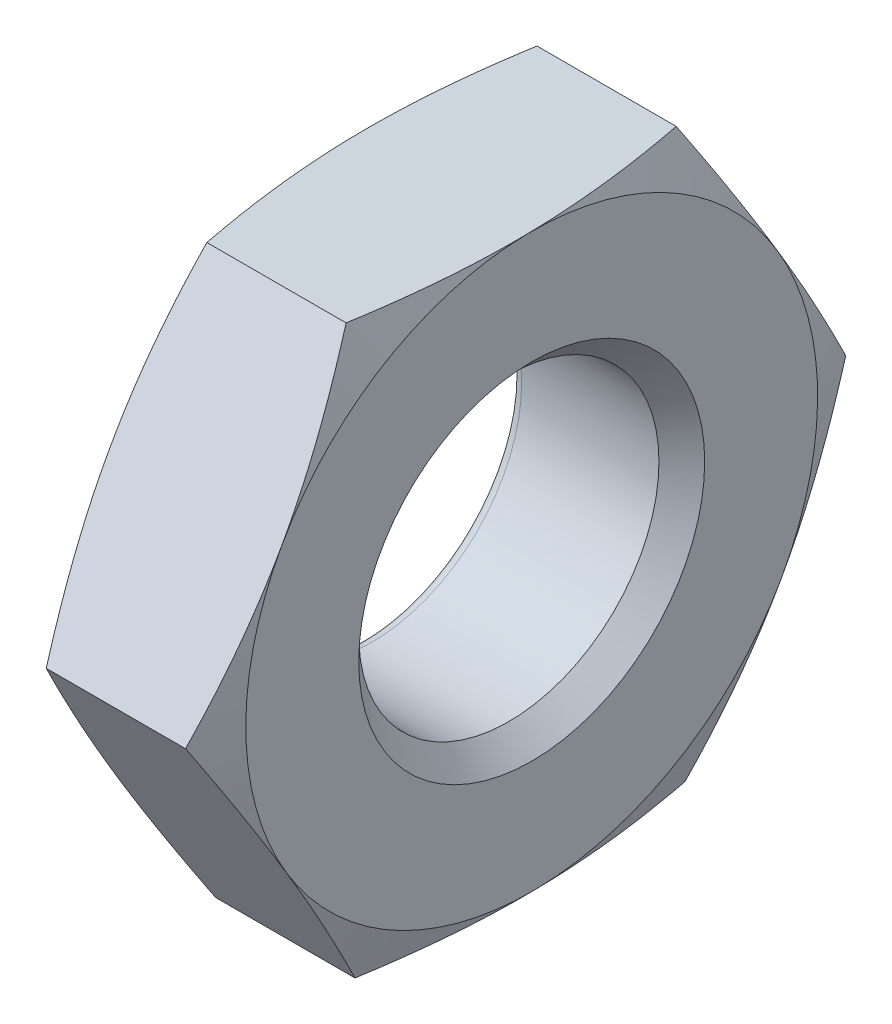
ISO-10303-21;
HEADER;
FILE_DESCRIPTION(('STEP AP214'),'2;1');
FILE_NAME('part.step','',(''),(''),'','','');
FILE_SCHEMA(('AUTOMOTIVE_DESIGN { 1 0 10303 214 1 1 1 1 }'));
ENDSEC;
DATA;
#1=APPLICATION_CONTEXT('core data for automotive mechanical design processes');
#2=APPLICATION_PROTOCOL_DEFINITION('international standard','automotive_design',2000,#1);
#3=PRODUCT_CONTEXT('',#1,'mechanical');
#4=PRODUCT('Part','Part','',(#3));
#5=PRODUCT_RELATED_PRODUCT_CATEGORY('part','',(#4));
#6=PRODUCT_DEFINITION_FORMATION('','',#4);
#7=PRODUCT_DEFINITION_CONTEXT('part definition',#1,'design');
#8=PRODUCT_DEFINITION('design','',#6,#7);
#9=PRODUCT_DEFINITION_SHAPE('','',#8);
#10=(LENGTH_UNIT() NAMED_UNIT(*) SI_UNIT(.MILLI.,.METRE.));
#11=(NAMED_UNIT(*) PLANE_ANGLE_UNIT() SI_UNIT($,.RADIAN.));
#12=(NAMED_UNIT(*) SI_UNIT($,.STERADIAN.) SOLID_ANGLE_UNIT());
#13=UNCERTAINTY_MEASURE_WITH_UNIT(LENGTH_MEASURE(1.E-05),#10,'distance_accuracy_value','');
#14=(GEOMETRIC_REPRESENTATION_CONTEXT(3) GLOBAL_UNCERTAINTY_ASSIGNED_CONTEXT((#13)) GLOBAL_UNIT_ASSIGNED_CONTEXT((#10,
#11,#12)) REPRESENTATION_CONTEXT('',''));
#15=CARTESIAN_POINT('',(0.,0.,0.));
#16=DIRECTION('',(0.,0.,1.));
#17=DIRECTION('',(1.,0.,0.));
#18=AXIS2_PLACEMENT_3D('',#15,#16,#17);
#19=CARTESIAN_POINT('',(3.,0.0896986148175169,-5.7728058595308));
#20=DIRECTION('',(0.,-0.513394444769561,0.858152751017996));
#21=DIRECTION('',(0.,-0.858152751017996,-0.513394444769561));
#22=AXIS2_PLACEMENT_3D('',#19,#20,#21);
#23=PLANE('',#22);
#24=CARTESIAN_POINT('',(0.283576670729648,5.04444583287809,-2.80860199958607));
#25=CARTESIAN_POINT('',(0.240044793758743,4.83925067211348,-2.93136109521931));
#26=CARTESIAN_POINT('',(0.200444967102058,4.63337885153907,-3.05452500618052));
#27=CARTESIAN_POINT('',(0.1307751369124,4.22029656600128,-3.30165367922414));
#28=CARTESIAN_POINT('',(0.100712591095272,4.01308518210938,-3.42561899106043));
#29=CARTESIAN_POINT('',(0.0520872621684073,3.5996234203263,-3.6729746877849));
#30=CARTESIAN_POINT('',(0.0334184162734771,3.39338248562457,-3.79635942323479));
#31=CARTESIAN_POINT('',(0.0083782410956004,2.98041830189354,-4.04341744124475));
#32=CARTESIAN_POINT('',(0.00200230024825227,2.77369526287067,-4.16709059816737));
#33=CARTESIAN_POINT('',(0.0020023002482523,2.36024918482494,-4.41443691201259));
#34=CARTESIAN_POINT('',(0.00837824109560048,2.15352614580207,-4.5381100689352));
#35=CARTESIAN_POINT('',(0.033418416273477,1.74056196207105,-4.78516808694517));
#36=CARTESIAN_POINT('',(0.052087262168407,1.53432102736931,-4.90855282239506));
#37=CARTESIAN_POINT('',(0.100712591095271,1.12085926558623,-5.15590851911952));
#38=CARTESIAN_POINT('',(0.1307751369124,0.913647881694327,-5.27987383095581));
#39=CARTESIAN_POINT('',(0.200444967102058,0.500565596156541,-5.52700250399944));
#40=CARTESIAN_POINT('',(0.240044793758742,0.294693775582126,-5.65016641496065));
#41=CARTESIAN_POINT('',(0.283576670729647,0.0894986148175177,-5.77292551059389));
#42=B_SPLINE_CURVE_WITH_KNOTS('',3,(#24,#25,#26,#27,#28,#29,#30,#31,#32,#33,#34,#35,#36,#37,#38,
#39,#40,#41),.UNSPECIFIED.,.F.,.F.,(4,2,2,2,2,2,2,2,4),(0.,0.729204056859502,1.45897692034932,
2.18184844414039,2.90444873686825,3.62704902959611,4.34992055338718,5.079693416877,
5.8088974737365),.UNSPECIFIED.);
#43=CARTESIAN_POINT('',(0.283534256223269,5.04424583287809,-2.80872165064916));
#44=VERTEX_POINT('',#43);
#45=CARTESIAN_POINT('',(0.283534256223269,0.0896986148175169,-5.7728058595308));
#46=VERTEX_POINT('',#45);
#47=EDGE_CURVE('E81',#44,#46,#42,.T.);
#48=ORIENTED_EDGE('',*,*,#47,.F.);
#49=DIRECTION('',(-1.,0.,0.));
#50=VECTOR('',#49,1.);
#51=CARTESIAN_POINT('',(3.,5.04424583287809,-2.80872165064916));
#52=LINE('',#51,#50);
#53=CARTESIAN_POINT('',(2.71846804402498,5.04424583287809,-2.80872165064916));
#54=VERTEX_POINT('',#53);
#55=EDGE_CURVE('E174',#54,#44,#52,.T.);
#56=ORIENTED_EDGE('',*,*,#55,.F.);
#57=CARTESIAN_POINT('',(2.7184256295186,0.0894986148175168,-5.77292551059389));
#58=CARTESIAN_POINT('',(2.76195750648951,0.294693775582126,-5.65016641496065));
#59=CARTESIAN_POINT('',(2.80155733314619,0.50056559615654,-5.52700250399944));
#60=CARTESIAN_POINT('',(2.87122716333585,0.913647881694325,-5.27987383095581));
#61=CARTESIAN_POINT('',(2.90128970915298,1.12085926558623,-5.15590851911952));
#62=CARTESIAN_POINT('',(2.94991503807985,1.53432102736931,-4.90855282239506));
#63=CARTESIAN_POINT('',(2.96858388397478,1.74056196207104,-4.78516808694517));
#64=CARTESIAN_POINT('',(2.99362405915265,2.15352614580207,-4.53811006893521));
#65=CARTESIAN_POINT('',(3.,2.36024918482494,-4.41443691201259));
#66=CARTESIAN_POINT('',(3.,2.77369526287067,-4.16709059816737));
#67=CARTESIAN_POINT('',(2.99362405915265,2.98041830189354,-4.04341744124475));
#68=CARTESIAN_POINT('',(2.96858388397478,3.39338248562456,-3.79635942323479));
#69=CARTESIAN_POINT('',(2.94991503807985,3.59962342032629,-3.6729746877849));
#70=CARTESIAN_POINT('',(2.90128970915298,4.01308518210938,-3.42561899106043));
#71=CARTESIAN_POINT('',(2.87122716333585,4.22029656600128,-3.30165367922414));
#72=CARTESIAN_POINT('',(2.80155733314619,4.63337885153907,-3.05452500618052));
#73=CARTESIAN_POINT('',(2.76195750648951,4.83925067211348,-2.93136109521931));
#74=CARTESIAN_POINT('',(2.7184256295186,5.04444583287809,-2.80860199958607));
#75=B_SPLINE_CURVE_WITH_KNOTS('',3,(#57,#58,#59,#60,#61,#62,#63,#64,#65,#66,#67,#68,#69,#70,#71,
#72,#73,#74),.UNSPECIFIED.,.F.,.F.,(4,2,2,2,2,2,2,2,4),(0.,0.729204056859501,1.45897692034932,
2.18184844414039,2.90444873686825,3.6270490295961,4.34992055338718,5.079693416877,
5.8088974737365),.UNSPECIFIED.);
#76=CARTESIAN_POINT('',(3.,2.5669722238478,-4.29076375508998));
#77=VERTEX_POINT('',#76);
#78=EDGE_CURVE('E245',#77,#54,#75,.T.);
#79=ORIENTED_EDGE('',*,*,#78,.F.);
#80=CARTESIAN_POINT('',(2.71846804402498,0.0896986148175169,-5.7728058595308));
#81=VERTEX_POINT('',#80);
#82=EDGE_CURVE('E329',#81,#77,#75,.T.);
#83=ORIENTED_EDGE('',*,*,#82,.F.);
#84=DIRECTION('',(-1.,0.,0.));
#85=VECTOR('',#84,1.);
#86=CARTESIAN_POINT('',(3.,0.0896986148175169,-5.7728058595308));
#87=LINE('',#86,#85);
#88=EDGE_CURVE('E161',#81,#46,#87,.T.);
#89=ORIENTED_EDGE('',*,*,#88,.T.);
#90=EDGE_LOOP('',(#48,#56,#79,#83,#89));
#91=FACE_BOUND('',#90,.T.);
#92=ADVANCED_FACE('F65',(#91),#23,.F.);
#93=CARTESIAN_POINT('',(3.,5.04424583287809,-2.80872165064916));
#94=DIRECTION('',(0.,-0.999879305093867,-0.0155362558232489));
#95=DIRECTION('',(0.,0.0155362558232489,-0.999879305093867));
#96=AXIS2_PLACEMENT_3D('',#93,#94,#95);
#97=PLANE('',#96);
#98=CARTESIAN_POINT('',(0.283570658585995,4.95454411043434,2.96428420888164));
#99=CARTESIAN_POINT('',(0.240039647965736,4.95825898323671,2.72520315367752));
#100=CARTESIAN_POINT('',(0.200440637574901,4.96198610620698,2.48533370457004));
#101=CARTESIAN_POINT('',(0.130772278026276,4.96946458665254,2.00403512683443));
#102=CARTESIAN_POINT('',(0.10071038616261,4.97321596076329,1.76260492758464));
#103=CARTESIAN_POINT('',(0.0520861274237187,4.9807013111892,1.28086421300148));
#104=CARTESIAN_POINT('',(0.0334177019958889,4.98443511655071,1.04056469986907));
#105=CARTESIAN_POINT('',(0.00837809404672546,4.99191145896575,0.559403721082165));
#106=CARTESIAN_POINT('',(0.00200230024825238,4.99565399221755,0.318542500099205));
#107=CARTESIAN_POINT('',(0.00200230024825251,5.00313905872113,-0.163179941866716));
#108=CARTESIAN_POINT('',(0.00837809404672572,5.00688159197292,-0.404041162849677));
#109=CARTESIAN_POINT('',(0.0334177019958892,5.01435793438796,-0.88520214163658));
#110=CARTESIAN_POINT('',(0.0520861274237189,5.01809173974948,-1.12550165476899));
#111=CARTESIAN_POINT('',(0.10071038616261,5.02557709017538,-1.60724236935215));
#112=CARTESIAN_POINT('',(0.130772278026276,5.02932846428613,-1.84867256860194));
#113=CARTESIAN_POINT('',(0.200440637574901,5.03680694473169,-2.32997114633756));
#114=CARTESIAN_POINT('',(0.240039647965736,5.04053406770197,-2.56984059544503));
#115=CARTESIAN_POINT('',(0.283570658585995,5.04424894050433,-2.80892165064916));
#116=B_SPLINE_CURVE_WITH_KNOTS('',3,(#98,#99,#100,#101,#102,#103,#104,#105,#106,#107,#108,#109,
#110,#111,#112,#113,#114,#115),.UNSPECIFIED.,.F.,.F.,(4,2,2,2,2,2,2,2,4),(0.,0.729195574202736,
1.45895992599574,2.18182315497732,2.90441516687303,3.62700717876873,4.34987040775031,
5.07963475954332,5.80883033374605),.UNSPECIFIED.);
#117=CARTESIAN_POINT('',(0.283534256223269,4.95454721806058,2.96408420888164));
#118=VERTEX_POINT('',#117);
#119=EDGE_CURVE('E290',#118,#44,#116,.T.);
#120=ORIENTED_EDGE('',*,*,#119,.F.);
#121=DIRECTION('',(-1.,0.,0.));
#122=VECTOR('',#121,1.);
#123=CARTESIAN_POINT('',(3.,4.95454721806058,2.96408420888164));
#124=LINE('',#123,#122);
#125=CARTESIAN_POINT('',(2.71846804402498,4.95454721806058,2.96408420888164));
#126=VERTEX_POINT('',#125);
#127=EDGE_CURVE('E171',#126,#118,#124,.T.);
#128=ORIENTED_EDGE('',*,*,#127,.F.);
#129=CARTESIAN_POINT('',(2.71843164166226,5.04424894050433,-2.80892165064916));
#130=CARTESIAN_POINT('',(2.76196265228252,5.04053406770197,-2.56984059544503));
#131=CARTESIAN_POINT('',(2.80156166267335,5.03680694473169,-2.32997114633756));
#132=CARTESIAN_POINT('',(2.87123002222198,5.02932846428613,-1.84867256860194));
#133=CARTESIAN_POINT('',(2.90129191408564,5.02557709017538,-1.60724236935215));
#134=CARTESIAN_POINT('',(2.94991617282453,5.01809173974948,-1.12550165476899));
#135=CARTESIAN_POINT('',(2.96858459825236,5.01435793438796,-0.88520214163658));
#136=CARTESIAN_POINT('',(2.99362420620153,5.00688159197292,-0.404041162849678));
#137=CARTESIAN_POINT('',(3.,5.00313905872113,-0.163179941866717));
#138=CARTESIAN_POINT('',(3.,4.99565399221755,0.318542500099204));
#139=CARTESIAN_POINT('',(2.99362420620153,4.99191145896575,0.559403721082164));
#140=CARTESIAN_POINT('',(2.96858459825236,4.98443511655071,1.04056469986907));
#141=CARTESIAN_POINT('',(2.94991617282453,4.9807013111892,1.28086421300148));
#142=CARTESIAN_POINT('',(2.90129191408564,4.97321596076329,1.76260492758464));
#143=CARTESIAN_POINT('',(2.87123002222198,4.96946458665254,2.00403512683443));
#144=CARTESIAN_POINT('',(2.80156166267335,4.96198610620698,2.48533370457004));
#145=CARTESIAN_POINT('',(2.76196265228252,4.95825898323671,2.72520315367752));
#146=CARTESIAN_POINT('',(2.71843164166226,4.95454411043434,2.96428420888164));
#147=B_SPLINE_CURVE_WITH_KNOTS('',3,(#129,#130,#131,#132,#133,#134,#135,#136,#137,#138,#139,
#140,#141,#142,#143,#144,#145,#146),.UNSPECIFIED.,.F.,.F.,(4,2,2,2,2,2,2,2,4),(0.,
0.729195574202736,1.45895992599574,2.18182315497732,2.90441516687303,3.62700717876873,
4.34987040775031,5.07963475954332,5.80883033374605),.UNSPECIFIED.);
#148=CARTESIAN_POINT('',(3.,4.99939652546934,0.0776812791162445));
#149=VERTEX_POINT('',#148);
#150=EDGE_CURVE('E307',#149,#126,#147,.T.);
#151=ORIENTED_EDGE('',*,*,#150,.F.);
#152=EDGE_CURVE('E312',#54,#149,#147,.T.);
#153=ORIENTED_EDGE('',*,*,#152,.F.);
#154=ORIENTED_EDGE('',*,*,#55,.T.);
#155=EDGE_LOOP('',(#120,#128,#151,#153,#154));
#156=FACE_BOUND('',#155,.T.);
#157=ADVANCED_FACE('F299',(#156),#97,.F.);
#158=CARTESIAN_POINT('',(3.,4.95454721806058,2.96408420888164));
#159=DIRECTION('',(0.,-0.486484860324306,-0.873689006841245));
#160=DIRECTION('',(0.,0.873689006841245,-0.486484860324306));
#161=AXIS2_PLACEMENT_3D('',#158,#159,#160);
#162=PLANE('',#161);
#163=CARTESIAN_POINT('',(0.283575916477035,-0.089898614817517,5.77291722292361));
#164=CARTESIAN_POINT('',(0.240044148193896,0.11901116335416,5.65659271447904));
#165=CARTESIAN_POINT('',(0.200444423941661,0.328609849777528,5.53988461023325));
#166=CARTESIAN_POINT('',(0.130774778251019,0.749170097182153,5.30570953006795));
#167=CARTESIAN_POINT('',(0.100712314475549,0.960132593720746,5.18824203321424));
#168=CARTESIAN_POINT('',(0.0520871198090276,1.38107918631032,4.95385182949597));
#169=CARTESIAN_POINT('',(0.0334183266637855,1.5910536682709,4.83693447592004));
#170=CARTESIAN_POINT('',(0.00837822264757874,2.01149367656581,4.60282634693077));
#171=CARTESIAN_POINT('',(0.00200230024825155,2.22195898909367,4.48563569056849));
#172=CARTESIAN_POINT('',(0.00200230024825172,2.64288961414939,4.25125437784395));
#173=CARTESIAN_POINT('',(0.00837822264757909,2.85335492667725,4.13406372148168));
#174=CARTESIAN_POINT('',(0.0334183266637859,3.27379493497216,3.8999555924924));
#175=CARTESIAN_POINT('',(0.0520871198090279,3.48376941693275,3.78303823891647));
#176=CARTESIAN_POINT('',(0.100712314475549,3.90471600952231,3.5486480351982));
#177=CARTESIAN_POINT('',(0.130774778251019,4.11567850606091,3.4311805383445));
#178=CARTESIAN_POINT('',(0.200444423941662,4.53623875346553,3.19700545817919));
#179=CARTESIAN_POINT('',(0.240044148193897,4.7458374398889,3.0802973539334));
#180=CARTESIAN_POINT('',(0.283575916477035,4.95474721806058,2.96397284548883));
#181=B_SPLINE_CURVE_WITH_KNOTS('',3,(#163,#164,#165,#166,#167,#168,#169,#170,#171,#172,#173,
#174,#175,#176,#177,#178,#179,#180),.UNSPECIFIED.,.F.,.F.,(4,2,2,2,2,2,2,2,4),(0.,
0.729202992672821,1.45897478833269,2.18184527150351,2.90444452536466,3.6270437792258,
4.34991426239662,5.0796860580565,5.80888905072932),.UNSPECIFIED.);
#182=CARTESIAN_POINT('',(0.283534256223268,-0.089698614817517,5.7728058595308));
#183=VERTEX_POINT('',#182);
#184=EDGE_CURVE('E284',#183,#118,#181,.T.);
#185=ORIENTED_EDGE('',*,*,#184,.F.);
#186=DIRECTION('',(-1.,0.,0.));
#187=VECTOR('',#186,1.);
#188=CARTESIAN_POINT('',(3.,-0.089698614817517,5.7728058595308));
#189=LINE('',#188,#187);
#190=CARTESIAN_POINT('',(2.71846804402498,-0.089698614817517,5.7728058595308));
#191=VERTEX_POINT('',#190);
#192=EDGE_CURVE('E163',#191,#183,#189,.T.);
#193=ORIENTED_EDGE('',*,*,#192,.F.);
#194=CARTESIAN_POINT('',(2.71842638377122,4.95474721806058,2.96397284548883));
#195=CARTESIAN_POINT('',(2.76195815205435,4.7458374398889,3.0802973539334));
#196=CARTESIAN_POINT('',(2.80155787630659,4.53623875346553,3.19700545817919));
#197=CARTESIAN_POINT('',(2.87122752199723,4.11567850606091,3.4311805383445));
#198=CARTESIAN_POINT('',(2.9012899857727,3.90471600952232,3.5486480351982));
#199=CARTESIAN_POINT('',(2.94991518043922,3.48376941693275,3.78303823891647));
#200=CARTESIAN_POINT('',(2.96858397358447,3.27379493497216,3.8999555924924));
#201=CARTESIAN_POINT('',(2.99362407760067,2.85335492667725,4.13406372148168));
#202=CARTESIAN_POINT('',(3.,2.64288961414939,4.25125437784395));
#203=CARTESIAN_POINT('',(3.,2.22195898909367,4.48563569056849));
#204=CARTESIAN_POINT('',(2.99362407760067,2.01149367656581,4.60282634693077));
#205=CARTESIAN_POINT('',(2.96858397358447,1.5910536682709,4.83693447592004));
#206=CARTESIAN_POINT('',(2.94991518043922,1.38107918631032,4.95385182949597));
#207=CARTESIAN_POINT('',(2.9012899857727,0.960132593720746,5.18824203321424));
#208=CARTESIAN_POINT('',(2.87122752199723,0.749170097182153,5.30570953006795));
#209=CARTESIAN_POINT('',(2.80155787630659,0.328609849777527,5.53988461023325));
#210=CARTESIAN_POINT('',(2.76195815205436,0.11901116335416,5.65659271447904));
#211=CARTESIAN_POINT('',(2.71842638377122,-0.0898986148175167,5.77291722292361));
#212=B_SPLINE_CURVE_WITH_KNOTS('',3,(#194,#195,#196,#197,#198,#199,#200,#201,#202,#203,#204,
#205,#206,#207,#208,#209,#210,#211),.UNSPECIFIED.,.F.,.F.,(4,2,2,2,2,2,2,2,4),(0.,
0.72920299267282,1.45897478833269,2.18184527150351,2.90444452536466,3.6270437792258,
4.34991426239662,5.0796860580565,5.80888905072932),.UNSPECIFIED.);
#213=CARTESIAN_POINT('',(3.,2.43242430162153,4.36844503420622));
#214=VERTEX_POINT('',#213);
#215=EDGE_CURVE('E208',#214,#191,#212,.T.);
#216=ORIENTED_EDGE('',*,*,#215,.F.);
#217=EDGE_CURVE('E313',#126,#214,#212,.T.);
#218=ORIENTED_EDGE('',*,*,#217,.F.);
#219=ORIENTED_EDGE('',*,*,#127,.T.);
#220=EDGE_LOOP('',(#185,#193,#216,#218,#219));
#221=FACE_BOUND('',#220,.T.);
#222=ADVANCED_FACE('F296',(#221),#162,.F.);
#223=CARTESIAN_POINT('',(3.,-0.089698614817517,5.7728058595308));
#224=DIRECTION('',(0.,0.513394444769561,-0.858152751017996));
#225=DIRECTION('',(0.,0.858152751017996,0.513394444769561));
#226=AXIS2_PLACEMENT_3D('',#223,#224,#225);
#227=PLANE('',#226);
#228=CARTESIAN_POINT('',(0.283576670729647,-5.04444583287809,2.80860199958606));
#229=CARTESIAN_POINT('',(0.240044793758742,-4.83925067211348,2.9313610952193));
#230=CARTESIAN_POINT('',(0.200444967102058,-4.63337885153907,3.05452500618052));
#231=CARTESIAN_POINT('',(0.130775136912399,-4.22029656600129,3.30165367922414));
#232=CARTESIAN_POINT('',(0.100712591095271,-4.01308518210938,3.42561899106043));
#233=CARTESIAN_POINT('',(0.0520872621684063,-3.5996234203263,3.67297468778489));
#234=CARTESIAN_POINT('',(0.0334184162734763,-3.39338248562457,3.79635942323478));
#235=CARTESIAN_POINT('',(0.00837824109559973,-2.98041830189354,4.04341744124475));
#236=CARTESIAN_POINT('',(0.00200230024825148,-2.77369526287067,4.16709059816736));
#237=CARTESIAN_POINT('',(0.00200230024825136,-2.36024918482494,4.41443691201259));
#238=CARTESIAN_POINT('',(0.0083782410955995,-2.15352614580207,4.5381100689352));
#239=CARTESIAN_POINT('',(0.033418416273476,-1.74056196207105,4.78516808694517));
#240=CARTESIAN_POINT('',(0.0520872621684062,-1.53432102736932,4.90855282239506));
#241=CARTESIAN_POINT('',(0.100712591095271,-1.12085926558623,5.15590851911952));
#242=CARTESIAN_POINT('',(0.130775136912399,-0.913647881694327,5.27987383095581));
#243=CARTESIAN_POINT('',(0.200444967102057,-0.500565596156541,5.52700250399944));
#244=CARTESIAN_POINT('',(0.240044793758742,-0.294693775582127,5.65016641496065));
#245=CARTESIAN_POINT('',(0.283576670729647,-0.0894986148175178,5.77292551059389));
#246=B_SPLINE_CURVE_WITH_KNOTS('',3,(#228,#229,#230,#231,#232,#233,#234,#235,#236,#237,#238,
#239,#240,#241,#242,#243,#244,#245),.UNSPECIFIED.,.F.,.F.,(4,2,2,2,2,2,2,2,4),(0.,
0.729204056859501,1.45897692034932,2.18184844414039,2.90444873686825,3.62704902959611,
4.34992055338718,5.079693416877,5.8088974737365),.UNSPECIFIED.);
#247=CARTESIAN_POINT('',(0.283534256223268,-5.04424583287809,2.80872165064915));
#248=VERTEX_POINT('',#247);
#249=EDGE_CURVE('E154',#248,#183,#246,.T.);
#250=ORIENTED_EDGE('',*,*,#249,.F.);
#251=DIRECTION('',(-1.,0.,0.));
#252=VECTOR('',#251,1.);
#253=CARTESIAN_POINT('',(3.,-5.04424583287809,2.80872165064915));
#254=LINE('',#253,#252);
#255=CARTESIAN_POINT('',(2.71846804402498,-5.04424583287809,2.80872165064915));
#256=VERTEX_POINT('',#255);
#257=EDGE_CURVE('E153',#256,#248,#254,.T.);
#258=ORIENTED_EDGE('',*,*,#257,.F.);
#259=CARTESIAN_POINT('',(2.71842562951861,-0.089498614817517,5.77292551059389));
#260=CARTESIAN_POINT('',(2.76195750648951,-0.294693775582126,5.65016641496065));
#261=CARTESIAN_POINT('',(2.8015573331462,-0.500565596156539,5.52700250399944));
#262=CARTESIAN_POINT('',(2.87122716333585,-0.913647881694325,5.27987383095581));
#263=CARTESIAN_POINT('',(2.90128970915298,-1.12085926558623,5.15590851911952));
#264=CARTESIAN_POINT('',(2.94991503807985,-1.53432102736931,4.90855282239506));
#265=CARTESIAN_POINT('',(2.96858388397478,-1.74056196207104,4.78516808694517));
#266=CARTESIAN_POINT('',(2.99362405915265,-2.15352614580207,4.5381100689352));
#267=CARTESIAN_POINT('',(3.,-2.36024918482494,4.41443691201259));
#268=CARTESIAN_POINT('',(3.,-2.77369526287067,4.16709059816736));
#269=CARTESIAN_POINT('',(2.99362405915265,-2.98041830189354,4.04341744124475));
#270=CARTESIAN_POINT('',(2.96858388397478,-3.39338248562456,3.79635942323478));
#271=CARTESIAN_POINT('',(2.94991503807985,-3.59962342032629,3.67297468778489));
#272=CARTESIAN_POINT('',(2.90128970915298,-4.01308518210938,3.42561899106043));
#273=CARTESIAN_POINT('',(2.87122716333585,-4.22029656600128,3.30165367922414));
#274=CARTESIAN_POINT('',(2.8015573331462,-4.63337885153907,3.05452500618052));
#275=CARTESIAN_POINT('',(2.76195750648951,-4.83925067211348,2.9313610952193));
#276=CARTESIAN_POINT('',(2.71842562951861,-5.04444583287809,2.80860199958606));
#277=B_SPLINE_CURVE_WITH_KNOTS('',3,(#259,#260,#261,#262,#263,#264,#265,#266,#267,#268,#269,
#270,#271,#272,#273,#274,#275,#276),.UNSPECIFIED.,.F.,.F.,(4,2,2,2,2,2,2,2,4),(0.,
0.729204056859502,1.45897692034932,2.18184844414039,2.90444873686825,3.62704902959611,
4.34992055338718,5.079693416877,5.8088974737365),.UNSPECIFIED.);
#278=CARTESIAN_POINT('',(3.,-2.56697222384781,4.29076375508998));
#279=VERTEX_POINT('',#278);
#280=EDGE_CURVE('E201',#279,#256,#277,.T.);
#281=ORIENTED_EDGE('',*,*,#280,.F.);
#282=EDGE_CURVE('E203',#191,#279,#277,.T.);
#283=ORIENTED_EDGE('',*,*,#282,.F.);
#284=ORIENTED_EDGE('',*,*,#192,.T.);
#285=EDGE_LOOP('',(#250,#258,#281,#283,#284));
#286=FACE_BOUND('',#285,.T.);
#287=ADVANCED_FACE('F202',(#286),#227,.F.);
#288=CARTESIAN_POINT('',(3.,-5.04424583287809,2.80872165064915));
#289=DIRECTION('',(0.,0.999879305093867,0.0155362558232488));
#290=DIRECTION('',(0.,-0.0155362558232488,0.999879305093867));
#291=AXIS2_PLACEMENT_3D('',#288,#289,#290);
#292=PLANE('',#291);
#293=CARTESIAN_POINT('',(0.283570658585996,-4.95454411043434,-2.96428420888164));
#294=CARTESIAN_POINT('',(0.240039647965736,-4.95825898323671,-2.72520315367752));
#295=CARTESIAN_POINT('',(0.200440637574902,-4.96198610620698,-2.48533370457005));
#296=CARTESIAN_POINT('',(0.130772278026276,-4.96946458665254,-2.00403512683443));
#297=CARTESIAN_POINT('',(0.10071038616261,-4.97321596076329,-1.76260492758464));
#298=CARTESIAN_POINT('',(0.0520861274237191,-4.9807013111892,-1.28086421300148));
#299=CARTESIAN_POINT('',(0.0334177019958895,-4.98443511655071,-1.04056469986907));
#300=CARTESIAN_POINT('',(0.00837809404672596,-4.99191145896575,-0.559403721082167));
#301=CARTESIAN_POINT('',(0.00200230024825268,-4.99565399221755,-0.318542500099206));
#302=CARTESIAN_POINT('',(0.00200230024825265,-5.00313905872113,0.163179941866714));
#303=CARTESIAN_POINT('',(0.00837809404672592,-5.00688159197292,0.404041162849675));
#304=CARTESIAN_POINT('',(0.0334177019958892,-5.01435793438796,0.885202141636578));
#305=CARTESIAN_POINT('',(0.0520861274237187,-5.01809173974948,1.12550165476899));
#306=CARTESIAN_POINT('',(0.100710386162609,-5.02557709017538,1.60724236935215));
#307=CARTESIAN_POINT('',(0.130772278026276,-5.02932846428613,1.84867256860194));
#308=CARTESIAN_POINT('',(0.200440637574901,-5.03680694473169,2.32997114633755));
#309=CARTESIAN_POINT('',(0.240039647965736,-5.04053406770197,2.56984059544503));
#310=CARTESIAN_POINT('',(0.283570658585995,-5.04424894050433,2.80892165064915));
#311=B_SPLINE_CURVE_WITH_KNOTS('',3,(#293,#294,#295,#296,#297,#298,#299,#300,#301,#302,#303,
#304,#305,#306,#307,#308,#309,#310),.UNSPECIFIED.,.F.,.F.,(4,2,2,2,2,2,2,2,4),(0.,
0.729195574202736,1.45895992599574,2.18182315497732,2.90441516687302,3.62700717876873,
4.34987040775031,5.07963475954331,5.80883033374605),.UNSPECIFIED.);
#312=CARTESIAN_POINT('',(0.283534256223269,-4.95454721806058,-2.96408420888164));
#313=VERTEX_POINT('',#312);
#314=EDGE_CURVE('E137',#313,#248,#311,.T.);
#315=ORIENTED_EDGE('',*,*,#314,.F.);
#316=DIRECTION('',(-1.,0.,0.));
#317=VECTOR('',#316,1.);
#318=CARTESIAN_POINT('',(3.,-4.95454721806058,-2.96408420888164));
#319=LINE('',#318,#317);
#320=CARTESIAN_POINT('',(2.71846804402498,-4.95454721806058,-2.96408420888164));
#321=VERTEX_POINT('',#320);
#322=EDGE_CURVE('E150',#321,#313,#319,.T.);
#323=ORIENTED_EDGE('',*,*,#322,.F.);
#324=CARTESIAN_POINT('',(2.71843164166226,-5.04424894050433,2.80892165064915));
#325=CARTESIAN_POINT('',(2.76196265228252,-5.04053406770197,2.56984059544503));
#326=CARTESIAN_POINT('',(2.80156166267335,-5.03680694473169,2.32997114633755));
#327=CARTESIAN_POINT('',(2.87123002222198,-5.02932846428613,1.84867256860194));
#328=CARTESIAN_POINT('',(2.90129191408564,-5.02557709017538,1.60724236935215));
#329=CARTESIAN_POINT('',(2.94991617282453,-5.01809173974948,1.12550165476899));
#330=CARTESIAN_POINT('',(2.96858459825236,-5.01435793438796,0.885202141636578));
#331=CARTESIAN_POINT('',(2.99362420620153,-5.00688159197292,0.404041162849676));
#332=CARTESIAN_POINT('',(3.,-5.00313905872113,0.163179941866715));
#333=CARTESIAN_POINT('',(3.,-4.99565399221755,-0.318542500099206));
#334=CARTESIAN_POINT('',(2.99362420620153,-4.99191145896575,-0.559403721082166));
#335=CARTESIAN_POINT('',(2.96858459825236,-4.98443511655071,-1.04056469986907));
#336=CARTESIAN_POINT('',(2.94991617282453,-4.9807013111892,-1.28086421300148));
#337=CARTESIAN_POINT('',(2.90129191408564,-4.97321596076329,-1.76260492758464));
#338=CARTESIAN_POINT('',(2.87123002222198,-4.96946458665254,-2.00403512683443));
#339=CARTESIAN_POINT('',(2.80156166267335,-4.96198610620698,-2.48533370457004));
#340=CARTESIAN_POINT('',(2.76196265228252,-4.95825898323671,-2.72520315367752));
#341=CARTESIAN_POINT('',(2.71843164166226,-4.95454411043434,-2.96428420888164));
#342=B_SPLINE_CURVE_WITH_KNOTS('',3,(#324,#325,#326,#327,#328,#329,#330,#331,#332,#333,#334,
#335,#336,#337,#338,#339,#340,#341),.UNSPECIFIED.,.F.,.F.,(4,2,2,2,2,2,2,2,4),(0.,
0.729195574202736,1.45895992599574,2.18182315497732,2.90441516687302,3.62700717876873,
4.34987040775031,5.07963475954331,5.80883033374605),.UNSPECIFIED.);
#343=CARTESIAN_POINT('',(3.,-4.99939652546934,-0.0776812791162438));
#344=VERTEX_POINT('',#343);
#345=EDGE_CURVE('E209',#344,#321,#342,.T.);
#346=ORIENTED_EDGE('',*,*,#345,.F.);
#347=EDGE_CURVE('E206',#256,#344,#342,.T.);
#348=ORIENTED_EDGE('',*,*,#347,.F.);
#349=ORIENTED_EDGE('',*,*,#257,.T.);
#350=EDGE_LOOP('',(#315,#323,#346,#348,#349));
#351=FACE_BOUND('',#350,.T.);
#352=ADVANCED_FACE('F148',(#351),#292,.F.);
#353=CARTESIAN_POINT('',(3.,-4.95454721806058,-2.96408420888164));
#354=DIRECTION('',(0.,0.486484860324306,0.873689006841245));
#355=DIRECTION('',(0.,-0.873689006841245,0.486484860324306));
#356=AXIS2_PLACEMENT_3D('',#353,#354,#355);
#357=PLANE('',#356);
#358=CARTESIAN_POINT('',(0.283575916477035,0.0898986148175169,-5.77291722292361));
#359=CARTESIAN_POINT('',(0.240044148193897,-0.119011163354161,-5.65659271447904));
#360=CARTESIAN_POINT('',(0.200444423941662,-0.328609849777528,-5.53988461023325));
#361=CARTESIAN_POINT('',(0.130774778251019,-0.749170097182152,-5.30570953006795));
#362=CARTESIAN_POINT('',(0.100712314475549,-0.960132593720745,-5.18824203321424));
#363=CARTESIAN_POINT('',(0.0520871198090281,-1.38107918631032,-4.95385182949597));
#364=CARTESIAN_POINT('',(0.0334183266637859,-1.5910536682709,-4.83693447592004));
#365=CARTESIAN_POINT('',(0.00837822264757909,-2.01149367656581,-4.60282634693077));
#366=CARTESIAN_POINT('',(0.00200230024825188,-2.22195898909367,-4.4856356905685));
#367=CARTESIAN_POINT('',(0.00200230024825193,-2.64288961414939,-4.25125437784395));
#368=CARTESIAN_POINT('',(0.00837822264757917,-2.85335492667725,-4.13406372148168));
#369=CARTESIAN_POINT('',(0.0334183266637859,-3.27379493497216,-3.89995559249241));
#370=CARTESIAN_POINT('',(0.0520871198090281,-3.48376941693275,-3.78303823891647));
#371=CARTESIAN_POINT('',(0.10071231447555,-3.90471600952231,-3.54864803519821));
#372=CARTESIAN_POINT('',(0.13077477825102,-4.11567850606091,-3.4311805383445));
#373=CARTESIAN_POINT('',(0.200444423941663,-4.53623875346553,-3.19700545817919));
#374=CARTESIAN_POINT('',(0.240044148193897,-4.7458374398889,-3.0802973539334));
#375=CARTESIAN_POINT('',(0.283575916477036,-4.95474721806058,-2.96397284548883));
#376=B_SPLINE_CURVE_WITH_KNOTS('',3,(#358,#359,#360,#361,#362,#363,#364,#365,#366,#367,#368,
#369,#370,#371,#372,#373,#374,#375),.UNSPECIFIED.,.F.,.F.,(4,2,2,2,2,2,2,2,4),(0.,
0.729202992672821,1.45897478833269,2.18184527150351,2.90444452536466,3.6270437792258,
4.34991426239662,5.0796860580565,5.80888905072932),.UNSPECIFIED.);
#377=EDGE_CURVE('E134',#46,#313,#376,.T.);
#378=ORIENTED_EDGE('',*,*,#377,.F.);
#379=ORIENTED_EDGE('',*,*,#88,.F.);
#380=CARTESIAN_POINT('',(2.71842638377122,-4.95474721806058,-2.96397284548883));
#381=CARTESIAN_POINT('',(2.76195815205435,-4.7458374398889,-3.0802973539334));
#382=CARTESIAN_POINT('',(2.80155787630659,-4.53623875346553,-3.19700545817919));
#383=CARTESIAN_POINT('',(2.87122752199723,-4.11567850606091,-3.4311805383445));
#384=CARTESIAN_POINT('',(2.9012899857727,-3.90471600952232,-3.5486480351982));
#385=CARTESIAN_POINT('',(2.94991518043922,-3.48376941693275,-3.78303823891647));
#386=CARTESIAN_POINT('',(2.96858397358447,-3.27379493497216,-3.8999555924924));
#387=CARTESIAN_POINT('',(2.99362407760067,-2.85335492667725,-4.13406372148168));
#388=CARTESIAN_POINT('',(3.,-2.64288961414939,-4.25125437784395));
#389=CARTESIAN_POINT('',(3.,-2.22195898909367,-4.48563569056849));
#390=CARTESIAN_POINT('',(2.99362407760067,-2.01149367656581,-4.60282634693077));
#391=CARTESIAN_POINT('',(2.96858397358447,-1.5910536682709,-4.83693447592004));
#392=CARTESIAN_POINT('',(2.94991518043922,-1.38107918631032,-4.95385182949597));
#393=CARTESIAN_POINT('',(2.9012899857727,-0.960132593720746,-5.18824203321424));
#394=CARTESIAN_POINT('',(2.87122752199723,-0.749170097182153,-5.30570953006795));
#395=CARTESIAN_POINT('',(2.80155787630659,-0.328609849777528,-5.53988461023325));
#396=CARTESIAN_POINT('',(2.76195815205436,-0.119011163354161,-5.65659271447904));
#397=CARTESIAN_POINT('',(2.71842638377122,0.0898986148175166,-5.77291722292361));
#398=B_SPLINE_CURVE_WITH_KNOTS('',3,(#380,#381,#382,#383,#384,#385,#386,#387,#388,#389,#390,
#391,#392,#393,#394,#395,#396,#397),.UNSPECIFIED.,.F.,.F.,(4,2,2,2,2,2,2,2,4),(0.,
0.729202992672821,1.45897478833269,2.18184527150351,2.90444452536466,3.6270437792258,
4.34991426239662,5.0796860580565,5.80888905072932),.UNSPECIFIED.);
#399=CARTESIAN_POINT('',(3.,-2.43242430162153,-4.36844503420622));
#400=VERTEX_POINT('',#399);
#401=EDGE_CURVE('E253',#400,#81,#398,.T.);
#402=ORIENTED_EDGE('',*,*,#401,.F.);
#403=EDGE_CURVE('E160',#321,#400,#398,.T.);
#404=ORIENTED_EDGE('',*,*,#403,.F.);
#405=ORIENTED_EDGE('',*,*,#322,.T.);
#406=EDGE_LOOP('',(#378,#379,#402,#404,#405));
#407=FACE_BOUND('',#406,.T.);
#408=ADVANCED_FACE('F157',(#407),#357,.F.);
#409=CARTESIAN_POINT('',(0.,0.,0.));
#410=DIRECTION('',(1.,0.,0.));
#411=DIRECTION('',(0.,0.,-1.));
#412=AXIS2_PLACEMENT_3D('',#409,#410,#411);
#413=PLANE('',#412);
#414=CARTESIAN_POINT('',(0.,0.,0.));
#415=DIRECTION('',(1.,0.,0.));
#416=DIRECTION('',(0.,0.,-1.));
#417=AXIS2_PLACEMENT_3D('',#414,#415,#416);
#418=CIRCLE('',#417,2.825);
#419=CARTESIAN_POINT('',(0.,0.,-2.825));
#420=VERTEX_POINT('',#419);
#421=EDGE_CURVE('E177',#420,#420,#418,.T.);
#422=ORIENTED_EDGE('',*,*,#421,.T.);
#423=EDGE_LOOP('',(#422));
#424=FACE_BOUND('',#423,.T.);
#425=CARTESIAN_POINT('',(0.,0.,0.));
#426=DIRECTION('',(-1.,0.,0.));
#427=DIRECTION('',(0.,0.,1.));
#428=AXIS2_PLACEMENT_3D('',#425,#426,#427);
#429=CIRCLE('',#428,4.99449872528096);
#430=CARTESIAN_POINT('',(0.,0.,4.99449872528096));
#431=VERTEX_POINT('',#430);
#432=EDGE_CURVE('E143',#431,#431,#429,.T.);
#433=ORIENTED_EDGE('',*,*,#432,.T.);
#434=EDGE_LOOP('',(#433));
#435=FACE_BOUND('',#434,.T.);
#436=ADVANCED_FACE('F265',(#424,#435),#413,.F.);
#437=CARTESIAN_POINT('',(3.,0.,0.));
#438=DIRECTION('',(1.,0.,0.));
#439=DIRECTION('',(0.,0.,-1.));
#440=AXIS2_PLACEMENT_3D('',#437,#438,#439);
#441=PLANE('',#440);
#442=CARTESIAN_POINT('',(3.,0.,0.));
#443=DIRECTION('',(1.,0.,0.));
#444=DIRECTION('',(0.,0.,-1.));
#445=AXIS2_PLACEMENT_3D('',#442,#443,#444);
#446=CIRCLE('',#445,3.025);
#447=CARTESIAN_POINT('',(3.,0.,-3.025));
#448=VERTEX_POINT('',#447);
#449=EDGE_CURVE('E454',#448,#448,#446,.T.);
#450=ORIENTED_EDGE('',*,*,#449,.F.);
#451=EDGE_LOOP('',(#450));
#452=FACE_BOUND('',#451,.T.);
#453=CARTESIAN_POINT('',(3.,0.,0.));
#454=DIRECTION('',(1.,0.,0.));
#455=DIRECTION('',(0.,0.,-1.));
#456=AXIS2_PLACEMENT_3D('',#453,#454,#455);
#457=CIRCLE('',#456,5.);
#458=EDGE_CURVE('E69',#400,#77,#457,.T.);
#459=ORIENTED_EDGE('',*,*,#458,.T.);
#460=CARTESIAN_POINT('',(3.,0.,0.));
#461=DIRECTION('',(1.,0.,0.));
#462=DIRECTION('',(0.,0.,-1.));
#463=AXIS2_PLACEMENT_3D('',#460,#461,#462);
#464=CIRCLE('',#463,5.);
#465=EDGE_CURVE('E89',#77,#149,#464,.T.);
#466=ORIENTED_EDGE('',*,*,#465,.T.);
#467=EDGE_CURVE('E15',#149,#214,#457,.T.);
#468=ORIENTED_EDGE('',*,*,#467,.T.);
#469=EDGE_CURVE('E74',#214,#279,#457,.T.);
#470=ORIENTED_EDGE('',*,*,#469,.T.);
#471=EDGE_CURVE('E188',#279,#344,#457,.T.);
#472=ORIENTED_EDGE('',*,*,#471,.T.);
#473=EDGE_CURVE('E184',#344,#400,#457,.T.);
#474=ORIENTED_EDGE('',*,*,#473,.T.);
#475=EDGE_LOOP('',(#459,#466,#468,#470,#472,#474));
#476=FACE_BOUND('',#475,.T.);
#477=ADVANCED_FACE('F195',(#452,#476),#441,.T.);
#478=CARTESIAN_POINT('',(3.,0.,0.));
#479=DIRECTION('',(1.,0.,0.));
#480=DIRECTION('',(0.,0.,-1.));
#481=AXIS2_PLACEMENT_3D('',#478,#479,#480);
#482=CYLINDRICAL_SURFACE('',#481,2.625);
#483=CARTESIAN_POINT('',(0.2,0.,0.));
#484=DIRECTION('',(1.,0.,0.));
#485=DIRECTION('',(0.,0.,-1.));
#486=AXIS2_PLACEMENT_3D('',#483,#484,#485);
#487=CIRCLE('',#486,2.625);
#488=CARTESIAN_POINT('',(0.2,0.,-2.625));
#489=VERTEX_POINT('',#488);
#490=EDGE_CURVE('E179',#489,#489,#487,.F.);
#491=ORIENTED_EDGE('',*,*,#490,.T.);
#492=EDGE_LOOP('',(#491));
#493=FACE_BOUND('',#492,.T.);
#494=CARTESIAN_POINT('',(2.6,0.,0.));
#495=DIRECTION('',(1.,0.,0.));
#496=DIRECTION('',(0.,0.,-1.));
#497=AXIS2_PLACEMENT_3D('',#494,#495,#496);
#498=CIRCLE('',#497,2.625);
#499=CARTESIAN_POINT('',(2.6,0.,-2.625));
#500=VERTEX_POINT('',#499);
#501=EDGE_CURVE('E165',#500,#500,#498,.T.);
#502=ORIENTED_EDGE('',*,*,#501,.T.);
#503=EDGE_LOOP('',(#502));
#504=FACE_BOUND('',#503,.T.);
#505=ADVANCED_FACE('F377',(#493,#504),#482,.F.);
#506=CARTESIAN_POINT('',(3.,0.,0.));
#507=DIRECTION('',(1.,0.,0.));
#508=DIRECTION('',(0.,0.,-1.));
#509=AXIS2_PLACEMENT_3D('',#506,#507,#508);
#510=CONICAL_SURFACE('',#509,3.025,0.785398163397446);
#511=ORIENTED_EDGE('',*,*,#501,.F.);
#512=EDGE_LOOP('',(#511));
#513=FACE_BOUND('',#512,.T.);
#514=ORIENTED_EDGE('',*,*,#449,.T.);
#515=EDGE_LOOP('',(#514));
#516=FACE_BOUND('',#515,.T.);
#517=ADVANCED_FACE('F240',(#513,#516),#510,.F.);
#518=CARTESIAN_POINT('',(0.2,0.,0.));
#519=DIRECTION('',(1.,0.,0.));
#520=DIRECTION('',(0.,0.,-1.));
#521=AXIS2_PLACEMENT_3D('',#518,#519,#520);
#522=TOROIDAL_SURFACE('',#521,2.825,0.2);
#523=ORIENTED_EDGE('',*,*,#490,.F.);
#524=EDGE_LOOP('',(#523));
#525=FACE_BOUND('',#524,.T.);
#526=ORIENTED_EDGE('',*,*,#421,.F.);
#527=EDGE_LOOP('',(#526));
#528=FACE_BOUND('',#527,.T.);
#529=ADVANCED_FACE('F67',(#525,#528),#522,.T.);
#530=CARTESIAN_POINT('',(3.,0.,0.));
#531=DIRECTION('',(-1.,0.,0.));
#532=DIRECTION('',(0.,0.,-1.));
#533=AXIS2_PLACEMENT_3D('',#530,#531,#532);
#534=CONICAL_SURFACE('',#533,5.,1.22173047639603);
#535=ORIENTED_EDGE('',*,*,#82,.T.);
#536=ORIENTED_EDGE('',*,*,#458,.F.);
#537=ORIENTED_EDGE('',*,*,#401,.T.);
#538=EDGE_LOOP('',(#535,#536,#537));
#539=FACE_BOUND('',#538,.T.);
#540=ADVANCED_FACE('F231',(#539),#534,.T.);
#541=ORIENTED_EDGE('',*,*,#345,.T.);
#542=ORIENTED_EDGE('',*,*,#403,.T.);
#543=ORIENTED_EDGE('',*,*,#473,.F.);
#544=EDGE_LOOP('',(#541,#542,#543));
#545=FACE_BOUND('',#544,.T.);
#546=ADVANCED_FACE('F236',(#545),#534,.T.);
#547=ORIENTED_EDGE('',*,*,#280,.T.);
#548=ORIENTED_EDGE('',*,*,#347,.T.);
#549=ORIENTED_EDGE('',*,*,#471,.F.);
#550=EDGE_LOOP('',(#547,#548,#549));
#551=FACE_BOUND('',#550,.T.);
#552=ADVANCED_FACE('F331',(#551),#534,.T.);
#553=ORIENTED_EDGE('',*,*,#215,.T.);
#554=ORIENTED_EDGE('',*,*,#282,.T.);
#555=ORIENTED_EDGE('',*,*,#469,.F.);
#556=EDGE_LOOP('',(#553,#554,#555));
#557=FACE_BOUND('',#556,.T.);
#558=ADVANCED_FACE('F317',(#557),#534,.T.);
#559=ORIENTED_EDGE('',*,*,#150,.T.);
#560=ORIENTED_EDGE('',*,*,#217,.T.);
#561=ORIENTED_EDGE('',*,*,#467,.F.);
#562=EDGE_LOOP('',(#559,#560,#561));
#563=FACE_BOUND('',#562,.T.);
#564=ADVANCED_FACE('F337',(#563),#534,.T.);
#565=ORIENTED_EDGE('',*,*,#78,.T.);
#566=ORIENTED_EDGE('',*,*,#152,.T.);
#567=ORIENTED_EDGE('',*,*,#465,.F.);
#568=EDGE_LOOP('',(#565,#566,#567));
#569=FACE_BOUND('',#568,.T.);
#570=ADVANCED_FACE('F238',(#569),#534,.T.);
#571=CARTESIAN_POINT('',(0.,0.,0.));
#572=DIRECTION('',(1.,0.,0.));
#573=DIRECTION('',(0.,0.,1.));
#574=AXIS2_PLACEMENT_3D('',#571,#572,#573);
#575=CONICAL_SURFACE('',#574,4.99449872528096,1.22173047639603);
#576=ORIENTED_EDGE('',*,*,#432,.F.);
#577=EDGE_LOOP('',(#576));
#578=FACE_BOUND('',#577,.T.);
#579=ORIENTED_EDGE('',*,*,#47,.T.);
#580=ORIENTED_EDGE('',*,*,#377,.T.);
#581=ORIENTED_EDGE('',*,*,#314,.T.);
#582=ORIENTED_EDGE('',*,*,#249,.T.);
#583=ORIENTED_EDGE('',*,*,#184,.T.);
#584=ORIENTED_EDGE('',*,*,#119,.T.);
#585=EDGE_LOOP('',(#579,#580,#581,#582,#583,#584));
#586=FACE_BOUND('',#585,.T.);
#587=ADVANCED_FACE('F136',(#578,#586),#575,.T.);
#588=CLOSED_SHELL('',(#92,#157,#222,#287,#352,#408,#436,#477,#505,#517,#529,#540,#546,#552,#558,
#564,#570,#587));
#589=MANIFOLD_SOLID_BREP('B2',#588);
#590=ADVANCED_BREP_SHAPE_REPRESENTATION('',(#18,#589),#14);
#591=SHAPE_DEFINITION_REPRESENTATION(#9,#590);
ENDSEC;
END-ISO-10303-21;
